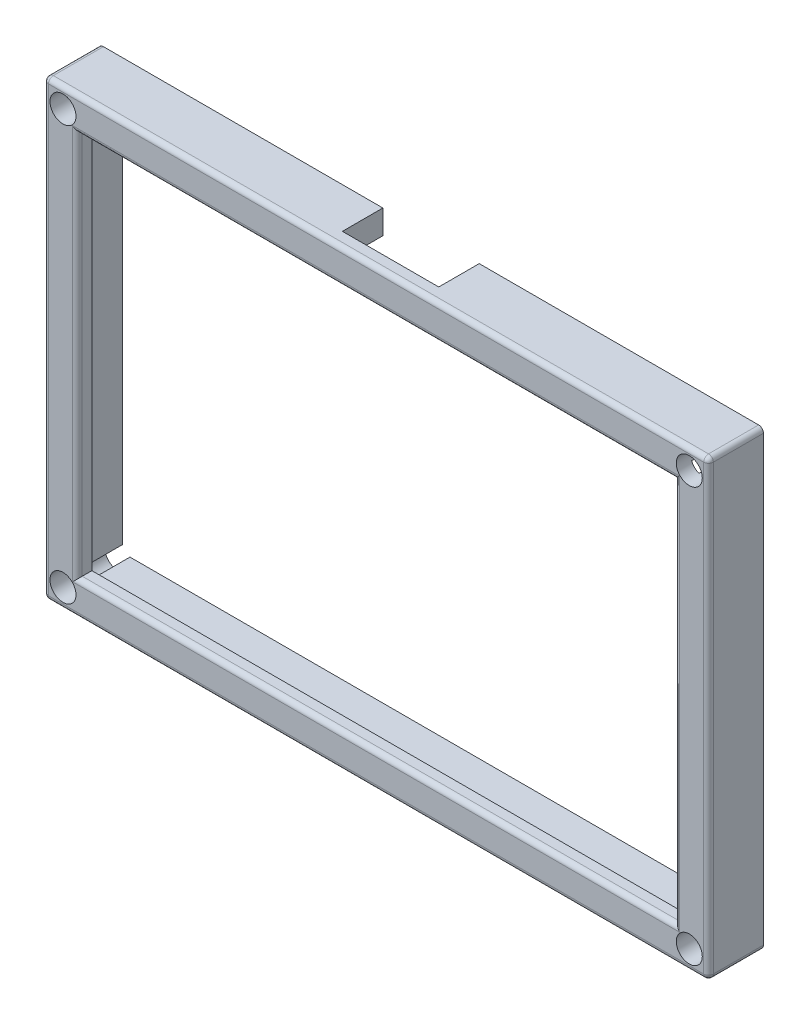
ISO-10303-21;
HEADER;
FILE_DESCRIPTION(('STEP AP214'),'2;1');
FILE_NAME('part.step','',(''),(''),'','','');
FILE_SCHEMA(('AUTOMOTIVE_DESIGN { 1 0 10303 214 1 1 1 1 }'));
ENDSEC;
DATA;
#1=APPLICATION_CONTEXT('core data for automotive mechanical design processes');
#2=APPLICATION_PROTOCOL_DEFINITION('international standard','automotive_design',2000,#1);
#3=PRODUCT_CONTEXT('',#1,'mechanical');
#4=PRODUCT('Part','Part','',(#3));
#5=PRODUCT_RELATED_PRODUCT_CATEGORY('part','',(#4));
#6=PRODUCT_DEFINITION_FORMATION('','',#4);
#7=PRODUCT_DEFINITION_CONTEXT('part definition',#1,'design');
#8=PRODUCT_DEFINITION('design','',#6,#7);
#9=PRODUCT_DEFINITION_SHAPE('','',#8);
#10=(LENGTH_UNIT() NAMED_UNIT(*) SI_UNIT(.MILLI.,.METRE.));
#11=(NAMED_UNIT(*) PLANE_ANGLE_UNIT() SI_UNIT($,.RADIAN.));
#12=(NAMED_UNIT(*) SI_UNIT($,.STERADIAN.) SOLID_ANGLE_UNIT());
#13=UNCERTAINTY_MEASURE_WITH_UNIT(LENGTH_MEASURE(1.E-05),#10,'distance_accuracy_value','');
#14=(GEOMETRIC_REPRESENTATION_CONTEXT(3) GLOBAL_UNCERTAINTY_ASSIGNED_CONTEXT((#13)) GLOBAL_UNIT_ASSIGNED_CONTEXT((#10,
#11,#12)) REPRESENTATION_CONTEXT('',''));
#15=CARTESIAN_POINT('',(0.,0.,0.));
#16=DIRECTION('',(0.,0.,1.));
#17=DIRECTION('',(1.,0.,0.));
#18=AXIS2_PLACEMENT_3D('',#15,#16,#17);
#19=CARTESIAN_POINT('',(-32.5,28.5,4.2));
#20=DIRECTION('',(0.,0.,-1.));
#21=DIRECTION('',(-1.,0.,0.));
#22=AXIS2_PLACEMENT_3D('',#19,#20,#21);
#23=CYLINDRICAL_SURFACE('',#22,1.35);
#24=CARTESIAN_POINT('',(-32.5,28.5,0.));
#25=DIRECTION('',(0.,0.,1.));
#26=DIRECTION('',(1.,0.,0.));
#27=AXIS2_PLACEMENT_3D('',#24,#25,#26);
#28=CIRCLE('',#27,1.35);
#29=CARTESIAN_POINT('',(-32.,29.7539936203984,0.));
#30=VERTEX_POINT('',#29);
#31=CARTESIAN_POINT('',(-31.2460063796015,29.,0.));
#32=VERTEX_POINT('',#31);
#33=EDGE_CURVE('E233',#30,#32,#28,.T.);
#34=ORIENTED_EDGE('',*,*,#33,.F.);
#35=DIRECTION('',(0.,0.,-1.));
#36=VECTOR('',#35,1.);
#37=CARTESIAN_POINT('',(-32.,29.7539936203984,4.2));
#38=LINE('',#37,#36);
#39=CARTESIAN_POINT('',(-32.,29.7539936203984,4.2));
#40=VERTEX_POINT('',#39);
#41=EDGE_CURVE('E346',#40,#30,#38,.T.);
#42=ORIENTED_EDGE('',*,*,#41,.F.);
#43=CARTESIAN_POINT('',(-32.5,28.5,4.2));
#44=DIRECTION('',(0.,0.,1.));
#45=DIRECTION('',(1.,0.,0.));
#46=AXIS2_PLACEMENT_3D('',#43,#44,#45);
#47=CIRCLE('',#46,1.35);
#48=CARTESIAN_POINT('',(-31.2460063796015,29.,4.2));
#49=VERTEX_POINT('',#48);
#50=EDGE_CURVE('E437',#40,#49,#47,.F.);
#51=ORIENTED_EDGE('',*,*,#50,.T.);
#52=DIRECTION('',(0.,0.,-1.));
#53=VECTOR('',#52,1.);
#54=CARTESIAN_POINT('',(-31.2460063796015,29.,4.2));
#55=LINE('',#54,#53);
#56=EDGE_CURVE('E282',#49,#32,#55,.T.);
#57=ORIENTED_EDGE('',*,*,#56,.T.);
#58=EDGE_LOOP('',(#34,#42,#51,#57));
#59=FACE_BOUND('',#58,.T.);
#60=CARTESIAN_POINT('',(-32.5,28.5,5.7));
#61=DIRECTION('',(0.,0.,1.));
#62=DIRECTION('',(1.,0.,0.));
#63=AXIS2_PLACEMENT_3D('',#60,#61,#62);
#64=CIRCLE('',#63,1.35);
#65=CARTESIAN_POINT('',(-31.15,28.5,5.7));
#66=VERTEX_POINT('',#65);
#67=EDGE_CURVE('E259',#66,#66,#64,.F.);
#68=ORIENTED_EDGE('',*,*,#67,.F.);
#69=EDGE_LOOP('',(#68));
#70=FACE_BOUND('',#69,.T.);
#71=ADVANCED_FACE('F41',(#59,#70),#23,.F.);
#72=CARTESIAN_POINT('',(-32.,0.,4.2));
#73=DIRECTION('',(1.,0.,0.));
#74=DIRECTION('',(0.,0.,-1.));
#75=AXIS2_PLACEMENT_3D('',#72,#73,#74);
#76=PLANE('',#75);
#77=DIRECTION('',(0.,-1.,0.));
#78=VECTOR('',#77,1.);
#79=CARTESIAN_POINT('',(-32.,0.,0.));
#80=LINE('',#79,#78);
#81=CARTESIAN_POINT('',(-32.,70.2460063796016,0.));
#82=VERTEX_POINT('',#81);
#83=EDGE_CURVE('E285',#82,#30,#80,.T.);
#84=ORIENTED_EDGE('',*,*,#83,.F.);
#85=DIRECTION('',(0.,0.,-1.));
#86=VECTOR('',#85,1.);
#87=CARTESIAN_POINT('',(-32.,70.2460063796016,4.2));
#88=LINE('',#87,#86);
#89=CARTESIAN_POINT('',(-32.,70.2460063796016,4.2));
#90=VERTEX_POINT('',#89);
#91=EDGE_CURVE('E344',#90,#82,#88,.T.);
#92=ORIENTED_EDGE('',*,*,#91,.F.);
#93=DIRECTION('',(0.,-1.,0.));
#94=VECTOR('',#93,1.);
#95=CARTESIAN_POINT('',(-32.,0.,4.2));
#96=LINE('',#95,#94);
#97=EDGE_CURVE('E265',#90,#40,#96,.T.);
#98=ORIENTED_EDGE('',*,*,#97,.T.);
#99=ORIENTED_EDGE('',*,*,#41,.T.);
#100=EDGE_LOOP('',(#84,#92,#98,#99));
#101=FACE_BOUND('',#100,.T.);
#102=ADVANCED_FACE('F475',(#101),#76,.T.);
#103=CARTESIAN_POINT('',(-32.5,71.5,4.2));
#104=DIRECTION('',(0.,0.,-1.));
#105=DIRECTION('',(-1.,0.,0.));
#106=AXIS2_PLACEMENT_3D('',#103,#104,#105);
#107=CYLINDRICAL_SURFACE('',#106,1.35);
#108=CARTESIAN_POINT('',(-32.5,71.5,0.));
#109=DIRECTION('',(0.,0.,1.));
#110=DIRECTION('',(1.,0.,0.));
#111=AXIS2_PLACEMENT_3D('',#108,#109,#110);
#112=CIRCLE('',#111,1.35);
#113=CARTESIAN_POINT('',(-31.2460063796015,71.,0.));
#114=VERTEX_POINT('',#113);
#115=EDGE_CURVE('E288',#114,#82,#112,.T.);
#116=ORIENTED_EDGE('',*,*,#115,.F.);
#117=DIRECTION('',(0.,0.,-1.));
#118=VECTOR('',#117,1.);
#119=CARTESIAN_POINT('',(-31.2460063796015,71.,4.2));
#120=LINE('',#119,#118);
#121=CARTESIAN_POINT('',(-31.2460063796015,71.,4.2));
#122=VERTEX_POINT('',#121);
#123=EDGE_CURVE('E342',#122,#114,#120,.T.);
#124=ORIENTED_EDGE('',*,*,#123,.F.);
#125=CARTESIAN_POINT('',(-32.5,71.5,4.2));
#126=DIRECTION('',(0.,0.,1.));
#127=DIRECTION('',(1.,0.,0.));
#128=AXIS2_PLACEMENT_3D('',#125,#126,#127);
#129=CIRCLE('',#128,1.35);
#130=EDGE_CURVE('E900',#122,#90,#129,.F.);
#131=ORIENTED_EDGE('',*,*,#130,.T.);
#132=ORIENTED_EDGE('',*,*,#91,.T.);
#133=EDGE_LOOP('',(#116,#124,#131,#132));
#134=FACE_BOUND('',#133,.T.);
#135=CARTESIAN_POINT('',(-32.5,71.5,5.7));
#136=DIRECTION('',(0.,0.,1.));
#137=DIRECTION('',(1.,0.,0.));
#138=AXIS2_PLACEMENT_3D('',#135,#136,#137);
#139=CIRCLE('',#138,1.35);
#140=CARTESIAN_POINT('',(-31.15,71.5,5.7));
#141=VERTEX_POINT('',#140);
#142=EDGE_CURVE('E887',#141,#141,#139,.F.);
#143=ORIENTED_EDGE('',*,*,#142,.F.);
#144=EDGE_LOOP('',(#143));
#145=FACE_BOUND('',#144,.T.);
#146=ADVANCED_FACE('F481',(#134,#145),#107,.F.);
#147=CARTESIAN_POINT('',(0.,71.,4.2));
#148=DIRECTION('',(0.,1.,0.));
#149=DIRECTION('',(0.,0.,1.));
#150=AXIS2_PLACEMENT_3D('',#147,#148,#149);
#151=PLANE('',#150);
#152=DIRECTION('',(1.,0.,0.));
#153=VECTOR('',#152,1.);
#154=CARTESIAN_POINT('',(0.,71.,0.));
#155=LINE('',#154,#153);
#156=CARTESIAN_POINT('',(-4.99999999999998,71.,0.));
#157=VERTEX_POINT('',#156);
#158=EDGE_CURVE('E291',#114,#157,#155,.T.);
#159=ORIENTED_EDGE('',*,*,#158,.T.);
#160=DIRECTION('',(0.,0.,-1.));
#161=VECTOR('',#160,1.);
#162=CARTESIAN_POINT('',(-4.99999999999998,71.,4.2));
#163=LINE('',#162,#161);
#164=CARTESIAN_POINT('',(-4.99999999999998,71.,4.2));
#165=VERTEX_POINT('',#164);
#166=EDGE_CURVE('E339',#165,#157,#163,.T.);
#167=ORIENTED_EDGE('',*,*,#166,.F.);
#168=DIRECTION('',(1.,0.,0.));
#169=VECTOR('',#168,1.);
#170=CARTESIAN_POINT('',(0.,71.,4.2));
#171=LINE('',#170,#169);
#172=EDGE_CURVE('E268',#122,#165,#171,.T.);
#173=ORIENTED_EDGE('',*,*,#172,.F.);
#174=ORIENTED_EDGE('',*,*,#123,.T.);
#175=EDGE_LOOP('',(#159,#167,#173,#174));
#176=FACE_BOUND('',#175,.T.);
#177=ADVANCED_FACE('F783',(#176),#151,.F.);
#178=CARTESIAN_POINT('',(-4.99999999999998,0.,4.2));
#179=DIRECTION('',(-1.,0.,0.));
#180=DIRECTION('',(0.,0.,1.));
#181=AXIS2_PLACEMENT_3D('',#178,#179,#180);
#182=PLANE('',#181);
#183=DIRECTION('',(0.,1.,0.));
#184=VECTOR('',#183,1.);
#185=CARTESIAN_POINT('',(-4.99999999999998,0.,0.));
#186=LINE('',#185,#184);
#187=CARTESIAN_POINT('',(-4.99999999999998,73.5,0.));
#188=VERTEX_POINT('',#187);
#189=EDGE_CURVE('E293',#157,#188,#186,.T.);
#190=ORIENTED_EDGE('',*,*,#189,.T.);
#191=DIRECTION('',(0.,0.,-1.));
#192=VECTOR('',#191,1.);
#193=CARTESIAN_POINT('',(-4.99999999999998,73.5,4.2));
#194=LINE('',#193,#192);
#195=CARTESIAN_POINT('',(-4.99999999999998,73.5,4.2));
#196=VERTEX_POINT('',#195);
#197=EDGE_CURVE('E336',#196,#188,#194,.T.);
#198=ORIENTED_EDGE('',*,*,#197,.F.);
#199=DIRECTION('',(0.,1.,0.));
#200=VECTOR('',#199,1.);
#201=CARTESIAN_POINT('',(-4.99999999999998,0.,4.2));
#202=LINE('',#201,#200);
#203=EDGE_CURVE('E271',#165,#196,#202,.T.);
#204=ORIENTED_EDGE('',*,*,#203,.F.);
#205=ORIENTED_EDGE('',*,*,#166,.T.);
#206=EDGE_LOOP('',(#190,#198,#204,#205));
#207=FACE_BOUND('',#206,.T.);
#208=ADVANCED_FACE('F682',(#207),#182,.F.);
#209=CARTESIAN_POINT('',(-34.5,0.,4.2));
#210=DIRECTION('',(1.,0.,0.));
#211=DIRECTION('',(0.,0.,-1.));
#212=AXIS2_PLACEMENT_3D('',#209,#210,#211);
#213=PLANE('',#212);
#214=DIRECTION('',(0.,-1.,0.));
#215=VECTOR('',#214,1.);
#216=CARTESIAN_POINT('',(-34.5,73.5,5.2));
#217=LINE('',#216,#215);
#218=CARTESIAN_POINT('',(-34.5,27.,5.2));
#219=VERTEX_POINT('',#218);
#220=CARTESIAN_POINT('',(-34.5,73.,5.2));
#221=VERTEX_POINT('',#220);
#222=EDGE_CURVE('E381',#219,#221,#217,.F.);
#223=ORIENTED_EDGE('',*,*,#222,.T.);
#224=DIRECTION('',(0.,0.,-1.));
#225=VECTOR('',#224,1.);
#226=CARTESIAN_POINT('',(-34.5,73.,0.));
#227=LINE('',#226,#225);
#228=CARTESIAN_POINT('',(-34.5,73.,0.));
#229=VERTEX_POINT('',#228);
#230=EDGE_CURVE('E383',#221,#229,#227,.T.);
#231=ORIENTED_EDGE('',*,*,#230,.T.);
#232=DIRECTION('',(0.,-1.,0.));
#233=VECTOR('',#232,1.);
#234=CARTESIAN_POINT('',(-34.5,0.,0.));
#235=LINE('',#234,#233);
#236=CARTESIAN_POINT('',(-34.5,27.,0.));
#237=VERTEX_POINT('',#236);
#238=EDGE_CURVE('E299',#229,#237,#235,.T.);
#239=ORIENTED_EDGE('',*,*,#238,.T.);
#240=DIRECTION('',(0.,0.,-1.));
#241=VECTOR('',#240,1.);
#242=CARTESIAN_POINT('',(-34.5,27.,4.2));
#243=LINE('',#242,#241);
#244=EDGE_CURVE('E379',#237,#219,#243,.F.);
#245=ORIENTED_EDGE('',*,*,#244,.T.);
#246=EDGE_LOOP('',(#223,#231,#239,#245));
#247=FACE_BOUND('',#246,.T.);
#248=ADVANCED_FACE('F677',(#247),#213,.F.);
#249=CARTESIAN_POINT('',(0.,26.5,4.2));
#250=DIRECTION('',(0.,1.,0.));
#251=DIRECTION('',(0.,0.,1.));
#252=AXIS2_PLACEMENT_3D('',#249,#250,#251);
#253=PLANE('',#252);
#254=DIRECTION('',(1.,0.,0.));
#255=VECTOR('',#254,1.);
#256=CARTESIAN_POINT('',(-34.5,26.5,5.2));
#257=LINE('',#256,#255);
#258=CARTESIAN_POINT('',(34.,26.5,5.2));
#259=VERTEX_POINT('',#258);
#260=CARTESIAN_POINT('',(-34.,26.5,5.2));
#261=VERTEX_POINT('',#260);
#262=EDGE_CURVE('E387',#259,#261,#257,.F.);
#263=ORIENTED_EDGE('',*,*,#262,.T.);
#264=DIRECTION('',(0.,0.,-1.));
#265=VECTOR('',#264,1.);
#266=CARTESIAN_POINT('',(-34.,26.5,4.2));
#267=LINE('',#266,#265);
#268=CARTESIAN_POINT('',(-34.,26.5,0.));
#269=VERTEX_POINT('',#268);
#270=EDGE_CURVE('E389',#261,#269,#267,.T.);
#271=ORIENTED_EDGE('',*,*,#270,.T.);
#272=DIRECTION('',(1.,0.,0.));
#273=VECTOR('',#272,1.);
#274=CARTESIAN_POINT('',(0.,26.5,0.));
#275=LINE('',#274,#273);
#276=CARTESIAN_POINT('',(34.,26.5,0.));
#277=VERTEX_POINT('',#276);
#278=EDGE_CURVE('E303',#269,#277,#275,.T.);
#279=ORIENTED_EDGE('',*,*,#278,.T.);
#280=DIRECTION('',(0.,0.,-1.));
#281=VECTOR('',#280,1.);
#282=CARTESIAN_POINT('',(34.,26.5,5.7));
#283=LINE('',#282,#281);
#284=EDGE_CURVE('E385',#277,#259,#283,.F.);
#285=ORIENTED_EDGE('',*,*,#284,.T.);
#286=EDGE_LOOP('',(#263,#271,#279,#285));
#287=FACE_BOUND('',#286,.T.);
#288=ADVANCED_FACE('F681',(#287),#253,.F.);
#289=CARTESIAN_POINT('',(34.5,0.,4.2));
#290=DIRECTION('',(1.,0.,0.));
#291=DIRECTION('',(0.,0.,-1.));
#292=AXIS2_PLACEMENT_3D('',#289,#290,#291);
#293=PLANE('',#292);
#294=DIRECTION('',(0.,-1.,0.));
#295=VECTOR('',#294,1.);
#296=CARTESIAN_POINT('',(34.5,0.,0.));
#297=LINE('',#296,#295);
#298=CARTESIAN_POINT('',(34.5,73.,0.));
#299=VERTEX_POINT('',#298);
#300=CARTESIAN_POINT('',(34.5,27.,0.));
#301=VERTEX_POINT('',#300);
#302=EDGE_CURVE('E306',#299,#301,#297,.T.);
#303=ORIENTED_EDGE('',*,*,#302,.F.);
#304=DIRECTION('',(0.,0.,-1.));
#305=VECTOR('',#304,1.);
#306=CARTESIAN_POINT('',(34.5,73.,4.2));
#307=LINE('',#306,#305);
#308=CARTESIAN_POINT('',(34.5,73.,5.2));
#309=VERTEX_POINT('',#308);
#310=EDGE_CURVE('E371',#299,#309,#307,.F.);
#311=ORIENTED_EDGE('',*,*,#310,.T.);
#312=DIRECTION('',(0.,1.,0.));
#313=VECTOR('',#312,1.);
#314=CARTESIAN_POINT('',(34.5,0.,5.2));
#315=LINE('',#314,#313);
#316=CARTESIAN_POINT('',(34.5,27.,5.2));
#317=VERTEX_POINT('',#316);
#318=EDGE_CURVE('E368',#309,#317,#315,.F.);
#319=ORIENTED_EDGE('',*,*,#318,.T.);
#320=DIRECTION('',(0.,0.,-1.));
#321=VECTOR('',#320,1.);
#322=CARTESIAN_POINT('',(34.5,27.,0.));
#323=LINE('',#322,#321);
#324=EDGE_CURVE('E366',#317,#301,#323,.T.);
#325=ORIENTED_EDGE('',*,*,#324,.T.);
#326=EDGE_LOOP('',(#303,#311,#319,#325));
#327=FACE_BOUND('',#326,.T.);
#328=ADVANCED_FACE('F692',(#327),#293,.T.);
#329=CARTESIAN_POINT('',(0.,73.5,4.2));
#330=DIRECTION('',(0.,1.,0.));
#331=DIRECTION('',(0.,0.,1.));
#332=AXIS2_PLACEMENT_3D('',#329,#330,#331);
#333=PLANE('',#332);
#334=DIRECTION('',(-1.,0.,0.));
#335=VECTOR('',#334,1.);
#336=CARTESIAN_POINT('',(0.,73.5,5.2));
#337=LINE('',#336,#335);
#338=CARTESIAN_POINT('',(-34.,73.5,5.2));
#339=VERTEX_POINT('',#338);
#340=CARTESIAN_POINT('',(34.,73.5,5.2));
#341=VERTEX_POINT('',#340);
#342=EDGE_CURVE('E375',#339,#341,#337,.F.);
#343=ORIENTED_EDGE('',*,*,#342,.T.);
#344=DIRECTION('',(0.,0.,-1.));
#345=VECTOR('',#344,1.);
#346=CARTESIAN_POINT('',(34.,73.5,4.2));
#347=LINE('',#346,#345);
#348=CARTESIAN_POINT('',(34.,73.5,0.));
#349=VERTEX_POINT('',#348);
#350=EDGE_CURVE('E377',#341,#349,#347,.T.);
#351=ORIENTED_EDGE('',*,*,#350,.T.);
#352=DIRECTION('',(1.,0.,0.));
#353=VECTOR('',#352,1.);
#354=CARTESIAN_POINT('',(0.,73.5,0.));
#355=LINE('',#354,#353);
#356=CARTESIAN_POINT('',(5.00000000000002,73.5,0.));
#357=VERTEX_POINT('',#356);
#358=EDGE_CURVE('E300',#357,#349,#355,.T.);
#359=ORIENTED_EDGE('',*,*,#358,.F.);
#360=DIRECTION('',(0.,0.,-1.));
#361=VECTOR('',#360,1.);
#362=CARTESIAN_POINT('',(5.00000000000002,73.5,4.2));
#363=LINE('',#362,#361);
#364=CARTESIAN_POINT('',(5.00000000000002,73.5,4.2));
#365=VERTEX_POINT('',#364);
#366=EDGE_CURVE('E334',#365,#357,#363,.T.);
#367=ORIENTED_EDGE('',*,*,#366,.F.);
#368=DIRECTION('',(-1.,0.,0.));
#369=VECTOR('',#368,1.);
#370=CARTESIAN_POINT('',(0.,73.5,4.2));
#371=LINE('',#370,#369);
#372=EDGE_CURVE('E903',#365,#196,#371,.T.);
#373=ORIENTED_EDGE('',*,*,#372,.T.);
#374=ORIENTED_EDGE('',*,*,#197,.T.);
#375=CARTESIAN_POINT('',(-34.,73.5,0.));
#376=VERTEX_POINT('',#375);
#377=EDGE_CURVE('E297',#376,#188,#355,.T.);
#378=ORIENTED_EDGE('',*,*,#377,.F.);
#379=DIRECTION('',(0.,0.,-1.));
#380=VECTOR('',#379,1.);
#381=CARTESIAN_POINT('',(-34.,73.5,5.7));
#382=LINE('',#381,#380);
#383=EDGE_CURVE('E373',#376,#339,#382,.F.);
#384=ORIENTED_EDGE('',*,*,#383,.T.);
#385=EDGE_LOOP('',(#343,#351,#359,#367,#373,#374,#378,#384));
#386=FACE_BOUND('',#385,.T.);
#387=ADVANCED_FACE('F701',(#386),#333,.T.);
#388=CARTESIAN_POINT('',(4.99999999999999,0.,4.2));
#389=DIRECTION('',(-1.,0.,0.));
#390=DIRECTION('',(0.,-1.,0.));
#391=AXIS2_PLACEMENT_3D('',#388,#389,#390);
#392=PLANE('',#391);
#393=DIRECTION('',(0.,1.,0.));
#394=VECTOR('',#393,1.);
#395=CARTESIAN_POINT('',(4.99999999999999,0.,0.));
#396=LINE('',#395,#394);
#397=CARTESIAN_POINT('',(5.00000000000002,71.,0.));
#398=VERTEX_POINT('',#397);
#399=EDGE_CURVE('E309',#398,#357,#396,.T.);
#400=ORIENTED_EDGE('',*,*,#399,.F.);
#401=DIRECTION('',(0.,0.,-1.));
#402=VECTOR('',#401,1.);
#403=CARTESIAN_POINT('',(5.00000000000002,71.,4.2));
#404=LINE('',#403,#402);
#405=CARTESIAN_POINT('',(5.00000000000002,71.,4.2));
#406=VERTEX_POINT('',#405);
#407=EDGE_CURVE('E332',#406,#398,#404,.T.);
#408=ORIENTED_EDGE('',*,*,#407,.F.);
#409=DIRECTION('',(0.,1.,0.));
#410=VECTOR('',#409,1.);
#411=CARTESIAN_POINT('',(4.99999999999999,0.,4.2));
#412=LINE('',#411,#410);
#413=EDGE_CURVE('E274',#406,#365,#412,.T.);
#414=ORIENTED_EDGE('',*,*,#413,.T.);
#415=ORIENTED_EDGE('',*,*,#366,.T.);
#416=EDGE_LOOP('',(#400,#408,#414,#415));
#417=FACE_BOUND('',#416,.T.);
#418=ADVANCED_FACE('F710',(#417),#392,.T.);
#419=CARTESIAN_POINT('',(31.2460063796016,71.,0.));
#420=VERTEX_POINT('',#419);
#421=EDGE_CURVE('E294',#398,#420,#155,.T.);
#422=ORIENTED_EDGE('',*,*,#421,.T.);
#423=DIRECTION('',(0.,0.,-1.));
#424=VECTOR('',#423,1.);
#425=CARTESIAN_POINT('',(31.2460063796016,71.,4.2));
#426=LINE('',#425,#424);
#427=CARTESIAN_POINT('',(31.2460063796016,71.,4.2));
#428=VERTEX_POINT('',#427);
#429=EDGE_CURVE('E330',#428,#420,#426,.T.);
#430=ORIENTED_EDGE('',*,*,#429,.F.);
#431=EDGE_CURVE('E272',#406,#428,#171,.T.);
#432=ORIENTED_EDGE('',*,*,#431,.F.);
#433=ORIENTED_EDGE('',*,*,#407,.T.);
#434=EDGE_LOOP('',(#422,#430,#432,#433));
#435=FACE_BOUND('',#434,.T.);
#436=ADVANCED_FACE('F772',(#435),#151,.F.);
#437=CARTESIAN_POINT('',(32.5,71.5,4.2));
#438=DIRECTION('',(0.,0.,-1.));
#439=DIRECTION('',(-1.,0.,0.));
#440=AXIS2_PLACEMENT_3D('',#437,#438,#439);
#441=CYLINDRICAL_SURFACE('',#440,1.35);
#442=CARTESIAN_POINT('',(32.5,71.5,0.));
#443=DIRECTION('',(0.,0.,1.));
#444=DIRECTION('',(1.,0.,0.));
#445=AXIS2_PLACEMENT_3D('',#442,#443,#444);
#446=CIRCLE('',#445,1.35);
#447=CARTESIAN_POINT('',(32.,70.2460063796016,0.));
#448=VERTEX_POINT('',#447);
#449=EDGE_CURVE('E312',#448,#420,#446,.T.);
#450=ORIENTED_EDGE('',*,*,#449,.F.);
#451=DIRECTION('',(0.,0.,-1.));
#452=VECTOR('',#451,1.);
#453=CARTESIAN_POINT('',(32.,70.2460063796016,4.2));
#454=LINE('',#453,#452);
#455=CARTESIAN_POINT('',(32.,70.2460063796016,4.2));
#456=VERTEX_POINT('',#455);
#457=EDGE_CURVE('E328',#456,#448,#454,.T.);
#458=ORIENTED_EDGE('',*,*,#457,.F.);
#459=CARTESIAN_POINT('',(32.5,71.5,4.2));
#460=DIRECTION('',(0.,0.,1.));
#461=DIRECTION('',(1.,0.,0.));
#462=AXIS2_PLACEMENT_3D('',#459,#460,#461);
#463=CIRCLE('',#462,1.35);
#464=EDGE_CURVE('E252',#456,#428,#463,.F.);
#465=ORIENTED_EDGE('',*,*,#464,.T.);
#466=ORIENTED_EDGE('',*,*,#429,.T.);
#467=EDGE_LOOP('',(#450,#458,#465,#466));
#468=FACE_BOUND('',#467,.T.);
#469=CARTESIAN_POINT('',(32.5,71.5,5.7));
#470=DIRECTION('',(0.,0.,1.));
#471=DIRECTION('',(1.,0.,0.));
#472=AXIS2_PLACEMENT_3D('',#469,#470,#471);
#473=CIRCLE('',#472,1.35);
#474=CARTESIAN_POINT('',(33.85,71.5,5.7));
#475=VERTEX_POINT('',#474);
#476=EDGE_CURVE('E889',#475,#475,#473,.F.);
#477=ORIENTED_EDGE('',*,*,#476,.F.);
#478=EDGE_LOOP('',(#477));
#479=FACE_BOUND('',#478,.T.);
#480=ADVANCED_FACE('F763',(#468,#479),#441,.F.);
#481=CARTESIAN_POINT('',(32.,0.,4.2));
#482=DIRECTION('',(1.,0.,0.));
#483=DIRECTION('',(0.,0.,-1.));
#484=AXIS2_PLACEMENT_3D('',#481,#482,#483);
#485=PLANE('',#484);
#486=DIRECTION('',(0.,-1.,0.));
#487=VECTOR('',#486,1.);
#488=CARTESIAN_POINT('',(32.,0.,0.));
#489=LINE('',#488,#487);
#490=CARTESIAN_POINT('',(32.,29.7539936203984,0.));
#491=VERTEX_POINT('',#490);
#492=EDGE_CURVE('E315',#448,#491,#489,.T.);
#493=ORIENTED_EDGE('',*,*,#492,.T.);
#494=DIRECTION('',(0.,0.,-1.));
#495=VECTOR('',#494,1.);
#496=CARTESIAN_POINT('',(32.,29.7539936203984,4.2));
#497=LINE('',#496,#495);
#498=CARTESIAN_POINT('',(32.,29.7539936203984,4.2));
#499=VERTEX_POINT('',#498);
#500=EDGE_CURVE('E326',#499,#491,#497,.T.);
#501=ORIENTED_EDGE('',*,*,#500,.F.);
#502=DIRECTION('',(0.,-1.,0.));
#503=VECTOR('',#502,1.);
#504=CARTESIAN_POINT('',(32.,0.,4.2));
#505=LINE('',#504,#503);
#506=EDGE_CURVE('E277',#456,#499,#505,.T.);
#507=ORIENTED_EDGE('',*,*,#506,.F.);
#508=ORIENTED_EDGE('',*,*,#457,.T.);
#509=EDGE_LOOP('',(#493,#501,#507,#508));
#510=FACE_BOUND('',#509,.T.);
#511=ADVANCED_FACE('F753',(#510),#485,.F.);
#512=CARTESIAN_POINT('',(32.5,28.5,4.2));
#513=DIRECTION('',(0.,0.,-1.));
#514=DIRECTION('',(-1.,0.,0.));
#515=AXIS2_PLACEMENT_3D('',#512,#513,#514);
#516=CYLINDRICAL_SURFACE('',#515,1.35);
#517=CARTESIAN_POINT('',(32.5,28.5,0.));
#518=DIRECTION('',(0.,0.,1.));
#519=DIRECTION('',(1.,0.,0.));
#520=AXIS2_PLACEMENT_3D('',#517,#518,#519);
#521=CIRCLE('',#520,1.35);
#522=CARTESIAN_POINT('',(31.2460063796016,29.,0.));
#523=VERTEX_POINT('',#522);
#524=EDGE_CURVE('E318',#523,#491,#521,.T.);
#525=ORIENTED_EDGE('',*,*,#524,.F.);
#526=DIRECTION('',(0.,0.,-1.));
#527=VECTOR('',#526,1.);
#528=CARTESIAN_POINT('',(31.2460063796016,29.,4.2));
#529=LINE('',#528,#527);
#530=CARTESIAN_POINT('',(31.2460063796016,29.,4.2));
#531=VERTEX_POINT('',#530);
#532=EDGE_CURVE('E324',#531,#523,#529,.T.);
#533=ORIENTED_EDGE('',*,*,#532,.F.);
#534=CARTESIAN_POINT('',(32.5,28.5,4.2));
#535=DIRECTION('',(0.,0.,1.));
#536=DIRECTION('',(1.,0.,0.));
#537=AXIS2_PLACEMENT_3D('',#534,#535,#536);
#538=CIRCLE('',#537,1.35);
#539=EDGE_CURVE('E249',#531,#499,#538,.F.);
#540=ORIENTED_EDGE('',*,*,#539,.T.);
#541=ORIENTED_EDGE('',*,*,#500,.T.);
#542=EDGE_LOOP('',(#525,#533,#540,#541));
#543=FACE_BOUND('',#542,.T.);
#544=CARTESIAN_POINT('',(32.5,28.5,5.7));
#545=DIRECTION('',(0.,0.,1.));
#546=DIRECTION('',(1.,0.,0.));
#547=AXIS2_PLACEMENT_3D('',#544,#545,#546);
#548=CIRCLE('',#547,1.35);
#549=CARTESIAN_POINT('',(33.85,28.5,5.7));
#550=VERTEX_POINT('',#549);
#551=EDGE_CURVE('E262',#550,#550,#548,.F.);
#552=ORIENTED_EDGE('',*,*,#551,.F.);
#553=EDGE_LOOP('',(#552));
#554=FACE_BOUND('',#553,.T.);
#555=ADVANCED_FACE('F745',(#543,#554),#516,.F.);
#556=CARTESIAN_POINT('',(0.,29.,4.2));
#557=DIRECTION('',(0.,1.,0.));
#558=DIRECTION('',(0.,0.,1.));
#559=AXIS2_PLACEMENT_3D('',#556,#557,#558);
#560=PLANE('',#559);
#561=DIRECTION('',(1.,0.,0.));
#562=VECTOR('',#561,1.);
#563=CARTESIAN_POINT('',(0.,29.,0.));
#564=LINE('',#563,#562);
#565=EDGE_CURVE('E269',#32,#523,#564,.T.);
#566=ORIENTED_EDGE('',*,*,#565,.F.);
#567=ORIENTED_EDGE('',*,*,#56,.F.);
#568=DIRECTION('',(1.,0.,0.));
#569=VECTOR('',#568,1.);
#570=CARTESIAN_POINT('',(0.,29.,4.2));
#571=LINE('',#570,#569);
#572=EDGE_CURVE('E279',#49,#531,#571,.T.);
#573=ORIENTED_EDGE('',*,*,#572,.T.);
#574=ORIENTED_EDGE('',*,*,#532,.T.);
#575=EDGE_LOOP('',(#566,#567,#573,#574));
#576=FACE_BOUND('',#575,.T.);
#577=ADVANCED_FACE('F673',(#576),#560,.T.);
#578=CARTESIAN_POINT('',(0.,0.,0.));
#579=DIRECTION('',(0.,0.,1.));
#580=DIRECTION('',(1.,0.,0.));
#581=AXIS2_PLACEMENT_3D('',#578,#579,#580);
#582=PLANE('',#581);
#583=ORIENTED_EDGE('',*,*,#358,.T.);
#584=CARTESIAN_POINT('',(34.,73.,0.));
#585=DIRECTION('',(0.,0.,1.));
#586=DIRECTION('',(1.,0.,0.));
#587=AXIS2_PLACEMENT_3D('',#584,#585,#586);
#588=CIRCLE('',#587,0.5);
#589=EDGE_CURVE('E11',#349,#299,#588,.F.);
#590=ORIENTED_EDGE('',*,*,#589,.T.);
#591=ORIENTED_EDGE('',*,*,#302,.T.);
#592=CARTESIAN_POINT('',(34.,27.,0.));
#593=DIRECTION('',(0.,0.,1.));
#594=DIRECTION('',(1.,0.,0.));
#595=AXIS2_PLACEMENT_3D('',#592,#593,#594);
#596=CIRCLE('',#595,0.5);
#597=EDGE_CURVE('E398',#301,#277,#596,.F.);
#598=ORIENTED_EDGE('',*,*,#597,.T.);
#599=ORIENTED_EDGE('',*,*,#278,.F.);
#600=CARTESIAN_POINT('',(-34.,27.,0.));
#601=DIRECTION('',(0.,0.,1.));
#602=DIRECTION('',(1.,0.,0.));
#603=AXIS2_PLACEMENT_3D('',#600,#601,#602);
#604=CIRCLE('',#603,0.5);
#605=EDGE_CURVE('E400',#269,#237,#604,.F.);
#606=ORIENTED_EDGE('',*,*,#605,.T.);
#607=ORIENTED_EDGE('',*,*,#238,.F.);
#608=CARTESIAN_POINT('',(-34.,73.,0.));
#609=DIRECTION('',(0.,0.,1.));
#610=DIRECTION('',(1.,0.,0.));
#611=AXIS2_PLACEMENT_3D('',#608,#609,#610);
#612=CIRCLE('',#611,0.5);
#613=EDGE_CURVE('E50',#229,#376,#612,.F.);
#614=ORIENTED_EDGE('',*,*,#613,.T.);
#615=ORIENTED_EDGE('',*,*,#377,.T.);
#616=ORIENTED_EDGE('',*,*,#189,.F.);
#617=ORIENTED_EDGE('',*,*,#158,.F.);
#618=ORIENTED_EDGE('',*,*,#115,.T.);
#619=ORIENTED_EDGE('',*,*,#83,.T.);
#620=ORIENTED_EDGE('',*,*,#33,.T.);
#621=ORIENTED_EDGE('',*,*,#565,.T.);
#622=ORIENTED_EDGE('',*,*,#524,.T.);
#623=ORIENTED_EDGE('',*,*,#492,.F.);
#624=ORIENTED_EDGE('',*,*,#449,.T.);
#625=ORIENTED_EDGE('',*,*,#421,.F.);
#626=ORIENTED_EDGE('',*,*,#399,.T.);
#627=EDGE_LOOP('',(#583,#590,#591,#598,#599,#606,#607,#614,#615,#616,#617,#618,#619,#620,#621,
#622,#623,#624,#625,#626));
#628=FACE_BOUND('',#627,.T.);
#629=ADVANCED_FACE('F717',(#628),#582,.F.);
#630=CARTESIAN_POINT('',(-31.,0.,5.7));
#631=DIRECTION('',(1.,0.,0.));
#632=DIRECTION('',(0.,0.,-1.));
#633=AXIS2_PLACEMENT_3D('',#630,#631,#632);
#634=PLANE('',#633);
#635=DIRECTION('',(0.,0.,-1.));
#636=VECTOR('',#635,1.);
#637=CARTESIAN_POINT('',(-31.,70.,5.7));
#638=LINE('',#637,#636);
#639=CARTESIAN_POINT('',(-31.,70.,5.2));
#640=VERTEX_POINT('',#639);
#641=CARTESIAN_POINT('',(-31.,70.,4.2));
#642=VERTEX_POINT('',#641);
#643=EDGE_CURVE('E226',#640,#642,#638,.T.);
#644=ORIENTED_EDGE('',*,*,#643,.F.);
#645=DIRECTION('',(0.,-1.,0.));
#646=VECTOR('',#645,1.);
#647=CARTESIAN_POINT('',(-31.,0.,5.2));
#648=LINE('',#647,#646);
#649=CARTESIAN_POINT('',(-31.,30.,5.2));
#650=VERTEX_POINT('',#649);
#651=EDGE_CURVE('E396',#640,#650,#648,.T.);
#652=ORIENTED_EDGE('',*,*,#651,.T.);
#653=DIRECTION('',(0.,0.,-1.));
#654=VECTOR('',#653,1.);
#655=CARTESIAN_POINT('',(-31.,30.,5.7));
#656=LINE('',#655,#654);
#657=CARTESIAN_POINT('',(-31.,30.,4.2));
#658=VERTEX_POINT('',#657);
#659=EDGE_CURVE('E248',#650,#658,#656,.T.);
#660=ORIENTED_EDGE('',*,*,#659,.T.);
#661=DIRECTION('',(0.,-1.,0.));
#662=VECTOR('',#661,1.);
#663=CARTESIAN_POINT('',(-31.,0.,4.2));
#664=LINE('',#663,#662);
#665=EDGE_CURVE('E241',#642,#658,#664,.T.);
#666=ORIENTED_EDGE('',*,*,#665,.F.);
#667=EDGE_LOOP('',(#644,#652,#660,#666));
#668=FACE_BOUND('',#667,.T.);
#669=ADVANCED_FACE('F246',(#668),#634,.T.);
#670=CARTESIAN_POINT('',(0.,70.,5.7));
#671=DIRECTION('',(0.,1.,0.));
#672=DIRECTION('',(0.,0.,1.));
#673=AXIS2_PLACEMENT_3D('',#670,#671,#672);
#674=PLANE('',#673);
#675=DIRECTION('',(0.,0.,-1.));
#676=VECTOR('',#675,1.);
#677=CARTESIAN_POINT('',(31.,70.,5.7));
#678=LINE('',#677,#676);
#679=CARTESIAN_POINT('',(31.,70.,5.2));
#680=VERTEX_POINT('',#679);
#681=CARTESIAN_POINT('',(31.,70.,4.2));
#682=VERTEX_POINT('',#681);
#683=EDGE_CURVE('E234',#680,#682,#678,.T.);
#684=ORIENTED_EDGE('',*,*,#683,.F.);
#685=DIRECTION('',(1.,0.,0.));
#686=VECTOR('',#685,1.);
#687=CARTESIAN_POINT('',(-31.,70.,5.2));
#688=LINE('',#687,#686);
#689=EDGE_CURVE('E58',#680,#640,#688,.F.);
#690=ORIENTED_EDGE('',*,*,#689,.T.);
#691=ORIENTED_EDGE('',*,*,#643,.T.);
#692=DIRECTION('',(1.,0.,0.));
#693=VECTOR('',#692,1.);
#694=CARTESIAN_POINT('',(0.,70.,4.2));
#695=LINE('',#694,#693);
#696=EDGE_CURVE('E229',#642,#682,#695,.T.);
#697=ORIENTED_EDGE('',*,*,#696,.T.);
#698=EDGE_LOOP('',(#684,#690,#691,#697));
#699=FACE_BOUND('',#698,.T.);
#700=ADVANCED_FACE('F228',(#699),#674,.F.);
#701=CARTESIAN_POINT('',(31.,0.,5.7));
#702=DIRECTION('',(1.,0.,0.));
#703=DIRECTION('',(0.,1.,0.));
#704=AXIS2_PLACEMENT_3D('',#701,#702,#703);
#705=PLANE('',#704);
#706=DIRECTION('',(0.,0.,-1.));
#707=VECTOR('',#706,1.);
#708=CARTESIAN_POINT('',(31.,30.,5.7));
#709=LINE('',#708,#707);
#710=CARTESIAN_POINT('',(31.,30.,5.2));
#711=VERTEX_POINT('',#710);
#712=CARTESIAN_POINT('',(31.,30.,4.2));
#713=VERTEX_POINT('',#712);
#714=EDGE_CURVE('E261',#711,#713,#709,.T.);
#715=ORIENTED_EDGE('',*,*,#714,.F.);
#716=DIRECTION('',(0.,-1.,0.));
#717=VECTOR('',#716,1.);
#718=CARTESIAN_POINT('',(31.,70.,5.2));
#719=LINE('',#718,#717);
#720=EDGE_CURVE('E66',#711,#680,#719,.F.);
#721=ORIENTED_EDGE('',*,*,#720,.T.);
#722=ORIENTED_EDGE('',*,*,#683,.T.);
#723=DIRECTION('',(0.,-1.,0.));
#724=VECTOR('',#723,1.);
#725=CARTESIAN_POINT('',(31.,0.,4.2));
#726=LINE('',#725,#724);
#727=EDGE_CURVE('E244',#682,#713,#726,.T.);
#728=ORIENTED_EDGE('',*,*,#727,.T.);
#729=EDGE_LOOP('',(#715,#721,#722,#728));
#730=FACE_BOUND('',#729,.T.);
#731=ADVANCED_FACE('F465',(#730),#705,.F.);
#732=CARTESIAN_POINT('',(0.,30.,5.7));
#733=DIRECTION('',(0.,1.,0.));
#734=DIRECTION('',(-1.,0.,0.));
#735=AXIS2_PLACEMENT_3D('',#732,#733,#734);
#736=PLANE('',#735);
#737=ORIENTED_EDGE('',*,*,#659,.F.);
#738=DIRECTION('',(1.,0.,0.));
#739=VECTOR('',#738,1.);
#740=CARTESIAN_POINT('',(0.,30.,5.2));
#741=LINE('',#740,#739);
#742=EDGE_CURVE('E391',#650,#711,#741,.T.);
#743=ORIENTED_EDGE('',*,*,#742,.T.);
#744=ORIENTED_EDGE('',*,*,#714,.T.);
#745=DIRECTION('',(1.,0.,0.));
#746=VECTOR('',#745,1.);
#747=CARTESIAN_POINT('',(0.,30.,4.2));
#748=LINE('',#747,#746);
#749=EDGE_CURVE('E257',#658,#713,#748,.T.);
#750=ORIENTED_EDGE('',*,*,#749,.F.);
#751=EDGE_LOOP('',(#737,#743,#744,#750));
#752=FACE_BOUND('',#751,.T.);
#753=ADVANCED_FACE('F464',(#752),#736,.T.);
#754=CARTESIAN_POINT('',(0.,0.,5.7));
#755=DIRECTION('',(0.,0.,1.));
#756=DIRECTION('',(1.,0.,0.));
#757=AXIS2_PLACEMENT_3D('',#754,#755,#756);
#758=PLANE('',#757);
#759=DIRECTION('',(1.,0.,0.));
#760=VECTOR('',#759,1.);
#761=CARTESIAN_POINT('',(34.5,27.,5.7));
#762=LINE('',#761,#760);
#763=CARTESIAN_POINT('',(-34.,27.,5.7));
#764=VERTEX_POINT('',#763);
#765=CARTESIAN_POINT('',(34.,27.,5.7));
#766=VERTEX_POINT('',#765);
#767=EDGE_CURVE('E357',#764,#766,#762,.T.);
#768=ORIENTED_EDGE('',*,*,#767,.T.);
#769=DIRECTION('',(0.,1.,0.));
#770=VECTOR('',#769,1.);
#771=CARTESIAN_POINT('',(34.,0.,5.7));
#772=LINE('',#771,#770);
#773=CARTESIAN_POINT('',(34.,73.,5.7));
#774=VERTEX_POINT('',#773);
#775=EDGE_CURVE('E363',#766,#774,#772,.T.);
#776=ORIENTED_EDGE('',*,*,#775,.T.);
#777=DIRECTION('',(-1.,0.,0.));
#778=VECTOR('',#777,1.);
#779=CARTESIAN_POINT('',(0.,73.,5.7));
#780=LINE('',#779,#778);
#781=CARTESIAN_POINT('',(-34.,73.,5.7));
#782=VERTEX_POINT('',#781);
#783=EDGE_CURVE('E361',#774,#782,#780,.T.);
#784=ORIENTED_EDGE('',*,*,#783,.T.);
#785=DIRECTION('',(0.,-1.,0.));
#786=VECTOR('',#785,1.);
#787=CARTESIAN_POINT('',(-34.,26.5,5.7));
#788=LINE('',#787,#786);
#789=EDGE_CURVE('E359',#782,#764,#788,.T.);
#790=ORIENTED_EDGE('',*,*,#789,.T.);
#791=EDGE_LOOP('',(#768,#776,#784,#790));
#792=FACE_BOUND('',#791,.T.);
#793=DIRECTION('',(0.,-1.,0.));
#794=VECTOR('',#793,1.);
#795=CARTESIAN_POINT('',(31.5,30.,5.7));
#796=LINE('',#795,#794);
#797=CARTESIAN_POINT('',(31.5,70.5,5.7));
#798=VERTEX_POINT('',#797);
#799=CARTESIAN_POINT('',(31.5,29.5,5.7));
#800=VERTEX_POINT('',#799);
#801=EDGE_CURVE('E352',#798,#800,#796,.T.);
#802=ORIENTED_EDGE('',*,*,#801,.T.);
#803=DIRECTION('',(1.,0.,0.));
#804=VECTOR('',#803,1.);
#805=CARTESIAN_POINT('',(0.,29.5,5.7));
#806=LINE('',#805,#804);
#807=CARTESIAN_POINT('',(-31.5,29.5,5.7));
#808=VERTEX_POINT('',#807);
#809=EDGE_CURVE('E354',#800,#808,#806,.F.);
#810=ORIENTED_EDGE('',*,*,#809,.T.);
#811=DIRECTION('',(0.,-1.,0.));
#812=VECTOR('',#811,1.);
#813=CARTESIAN_POINT('',(-31.5,0.,5.7));
#814=LINE('',#813,#812);
#815=CARTESIAN_POINT('',(-31.5,70.5,5.7));
#816=VERTEX_POINT('',#815);
#817=EDGE_CURVE('E348',#808,#816,#814,.F.);
#818=ORIENTED_EDGE('',*,*,#817,.T.);
#819=DIRECTION('',(1.,0.,0.));
#820=VECTOR('',#819,1.);
#821=CARTESIAN_POINT('',(31.,70.5,5.7));
#822=LINE('',#821,#820);
#823=EDGE_CURVE('E350',#816,#798,#822,.T.);
#824=ORIENTED_EDGE('',*,*,#823,.T.);
#825=EDGE_LOOP('',(#802,#810,#818,#824));
#826=FACE_BOUND('',#825,.T.);
#827=ORIENTED_EDGE('',*,*,#67,.T.);
#828=EDGE_LOOP('',(#827));
#829=FACE_BOUND('',#828,.T.);
#830=ORIENTED_EDGE('',*,*,#142,.T.);
#831=EDGE_LOOP('',(#830));
#832=FACE_BOUND('',#831,.T.);
#833=ORIENTED_EDGE('',*,*,#476,.T.);
#834=EDGE_LOOP('',(#833));
#835=FACE_BOUND('',#834,.T.);
#836=ORIENTED_EDGE('',*,*,#551,.T.);
#837=EDGE_LOOP('',(#836));
#838=FACE_BOUND('',#837,.T.);
#839=ADVANCED_FACE('F455',(#792,#826,#829,#832,#835,#838),#758,.T.);
#840=CARTESIAN_POINT('',(0.,0.,4.2));
#841=DIRECTION('',(0.,0.,1.));
#842=DIRECTION('',(1.,0.,0.));
#843=AXIS2_PLACEMENT_3D('',#840,#841,#842);
#844=PLANE('',#843);
#845=ORIENTED_EDGE('',*,*,#97,.F.);
#846=ORIENTED_EDGE('',*,*,#130,.F.);
#847=ORIENTED_EDGE('',*,*,#172,.T.);
#848=ORIENTED_EDGE('',*,*,#203,.T.);
#849=ORIENTED_EDGE('',*,*,#372,.F.);
#850=ORIENTED_EDGE('',*,*,#413,.F.);
#851=ORIENTED_EDGE('',*,*,#431,.T.);
#852=ORIENTED_EDGE('',*,*,#464,.F.);
#853=ORIENTED_EDGE('',*,*,#506,.T.);
#854=ORIENTED_EDGE('',*,*,#539,.F.);
#855=ORIENTED_EDGE('',*,*,#572,.F.);
#856=ORIENTED_EDGE('',*,*,#50,.F.);
#857=EDGE_LOOP('',(#845,#846,#847,#848,#849,#850,#851,#852,#853,#854,#855,#856));
#858=FACE_BOUND('',#857,.T.);
#859=ORIENTED_EDGE('',*,*,#665,.T.);
#860=ORIENTED_EDGE('',*,*,#749,.T.);
#861=ORIENTED_EDGE('',*,*,#727,.F.);
#862=ORIENTED_EDGE('',*,*,#696,.F.);
#863=EDGE_LOOP('',(#859,#860,#861,#862));
#864=FACE_BOUND('',#863,.T.);
#865=ADVANCED_FACE('F239',(#858,#864),#844,.F.);
#866=CARTESIAN_POINT('',(-34.,27.,4.2));
#867=DIRECTION('',(0.,0.,-1.));
#868=DIRECTION('',(-1.,0.,0.));
#869=AXIS2_PLACEMENT_3D('',#866,#867,#868);
#870=CYLINDRICAL_SURFACE('',#869,0.5);
#871=ORIENTED_EDGE('',*,*,#605,.F.);
#872=ORIENTED_EDGE('',*,*,#270,.F.);
#873=CARTESIAN_POINT('',(-34.,27.,5.2));
#874=DIRECTION('',(0.,0.,1.));
#875=DIRECTION('',(1.,0.,0.));
#876=AXIS2_PLACEMENT_3D('',#873,#874,#875);
#877=CIRCLE('',#876,0.5);
#878=EDGE_CURVE('E434',#219,#261,#877,.T.);
#879=ORIENTED_EDGE('',*,*,#878,.F.);
#880=ORIENTED_EDGE('',*,*,#244,.F.);
#881=EDGE_LOOP('',(#871,#872,#879,#880));
#882=FACE_BOUND('',#881,.T.);
#883=ADVANCED_FACE('F531',(#882),#870,.T.);
#884=CARTESIAN_POINT('',(-34.,0.,5.2));
#885=DIRECTION('',(0.,1.,0.));
#886=DIRECTION('',(0.,0.,1.));
#887=AXIS2_PLACEMENT_3D('',#884,#885,#886);
#888=CYLINDRICAL_SURFACE('',#887,0.5);
#889=CARTESIAN_POINT('',(-34.,73.,5.2));
#890=DIRECTION('',(0.,1.,0.));
#891=DIRECTION('',(0.,0.,1.));
#892=AXIS2_PLACEMENT_3D('',#889,#890,#891);
#893=CIRCLE('',#892,0.5);
#894=EDGE_CURVE('E428',#221,#782,#893,.T.);
#895=ORIENTED_EDGE('',*,*,#894,.F.);
#896=ORIENTED_EDGE('',*,*,#222,.F.);
#897=CARTESIAN_POINT('',(-34.,27.,5.2));
#898=DIRECTION('',(0.,-1.,0.));
#899=DIRECTION('',(0.,0.,-1.));
#900=AXIS2_PLACEMENT_3D('',#897,#898,#899);
#901=CIRCLE('',#900,0.5);
#902=EDGE_CURVE('E431',#764,#219,#901,.T.);
#903=ORIENTED_EDGE('',*,*,#902,.F.);
#904=ORIENTED_EDGE('',*,*,#789,.F.);
#905=EDGE_LOOP('',(#895,#896,#903,#904));
#906=FACE_BOUND('',#905,.T.);
#907=ADVANCED_FACE('F527',(#906),#888,.T.);
#908=CARTESIAN_POINT('',(-34.,73.,4.2));
#909=DIRECTION('',(0.,0.,1.));
#910=DIRECTION('',(1.,0.,0.));
#911=AXIS2_PLACEMENT_3D('',#908,#909,#910);
#912=CYLINDRICAL_SURFACE('',#911,0.5);
#913=ORIENTED_EDGE('',*,*,#613,.F.);
#914=ORIENTED_EDGE('',*,*,#230,.F.);
#915=CARTESIAN_POINT('',(-34.,73.,5.2));
#916=DIRECTION('',(0.,0.,1.));
#917=DIRECTION('',(1.,0.,0.));
#918=AXIS2_PLACEMENT_3D('',#915,#916,#917);
#919=CIRCLE('',#918,0.5);
#920=EDGE_CURVE('E425',#339,#221,#919,.T.);
#921=ORIENTED_EDGE('',*,*,#920,.F.);
#922=ORIENTED_EDGE('',*,*,#383,.F.);
#923=EDGE_LOOP('',(#913,#914,#921,#922));
#924=FACE_BOUND('',#923,.T.);
#925=ADVANCED_FACE('F523',(#924),#912,.T.);
#926=CARTESIAN_POINT('',(-34.,27.,5.2));
#927=DIRECTION('',(-1.,0.,0.));
#928=DIRECTION('',(0.,0.,1.));
#929=AXIS2_PLACEMENT_3D('',#926,#927,#928);
#930=SPHERICAL_SURFACE('',#929,0.5);
#931=ORIENTED_EDGE('',*,*,#902,.T.);
#932=ORIENTED_EDGE('',*,*,#878,.T.);
#933=CARTESIAN_POINT('',(-34.,27.,5.2));
#934=DIRECTION('',(-1.,0.,0.));
#935=DIRECTION('',(0.,0.,1.));
#936=AXIS2_PLACEMENT_3D('',#933,#934,#935);
#937=CIRCLE('',#936,0.5);
#938=EDGE_CURVE('E422',#764,#261,#937,.F.);
#939=ORIENTED_EDGE('',*,*,#938,.F.);
#940=EDGE_LOOP('',(#931,#932,#939));
#941=FACE_BOUND('',#940,.T.);
#942=ADVANCED_FACE('F519',(#941),#930,.T.);
#943=CARTESIAN_POINT('',(-34.,73.,5.2));
#944=DIRECTION('',(-1.,0.,0.));
#945=DIRECTION('',(0.,0.,1.));
#946=AXIS2_PLACEMENT_3D('',#943,#944,#945);
#947=SPHERICAL_SURFACE('',#946,0.5);
#948=ORIENTED_EDGE('',*,*,#920,.T.);
#949=ORIENTED_EDGE('',*,*,#894,.T.);
#950=CARTESIAN_POINT('',(-34.,73.,5.2));
#951=DIRECTION('',(-1.,0.,0.));
#952=DIRECTION('',(0.,0.,1.));
#953=AXIS2_PLACEMENT_3D('',#950,#951,#952);
#954=CIRCLE('',#953,0.5);
#955=EDGE_CURVE('E419',#339,#782,#954,.F.);
#956=ORIENTED_EDGE('',*,*,#955,.F.);
#957=EDGE_LOOP('',(#948,#949,#956));
#958=FACE_BOUND('',#957,.T.);
#959=ADVANCED_FACE('F515',(#958),#947,.T.);
#960=CARTESIAN_POINT('',(34.,27.,4.2));
#961=DIRECTION('',(0.,0.,1.));
#962=DIRECTION('',(1.,0.,0.));
#963=AXIS2_PLACEMENT_3D('',#960,#961,#962);
#964=CYLINDRICAL_SURFACE('',#963,0.5);
#965=ORIENTED_EDGE('',*,*,#597,.F.);
#966=ORIENTED_EDGE('',*,*,#324,.F.);
#967=CARTESIAN_POINT('',(34.,27.,5.2));
#968=DIRECTION('',(0.,0.,1.));
#969=DIRECTION('',(1.,0.,0.));
#970=AXIS2_PLACEMENT_3D('',#967,#968,#969);
#971=CIRCLE('',#970,0.5);
#972=EDGE_CURVE('E416',#259,#317,#971,.T.);
#973=ORIENTED_EDGE('',*,*,#972,.F.);
#974=ORIENTED_EDGE('',*,*,#284,.F.);
#975=EDGE_LOOP('',(#965,#966,#973,#974));
#976=FACE_BOUND('',#975,.T.);
#977=ADVANCED_FACE('F511',(#976),#964,.T.);
#978=CARTESIAN_POINT('',(0.,27.,5.2));
#979=DIRECTION('',(-1.,0.,0.));
#980=DIRECTION('',(0.,0.,1.));
#981=AXIS2_PLACEMENT_3D('',#978,#979,#980);
#982=CYLINDRICAL_SURFACE('',#981,0.5);
#983=ORIENTED_EDGE('',*,*,#938,.T.);
#984=ORIENTED_EDGE('',*,*,#262,.F.);
#985=CARTESIAN_POINT('',(34.,27.,5.2));
#986=DIRECTION('',(1.,0.,0.));
#987=DIRECTION('',(0.,0.,-1.));
#988=AXIS2_PLACEMENT_3D('',#985,#986,#987);
#989=CIRCLE('',#988,0.5);
#990=EDGE_CURVE('E413',#766,#259,#989,.T.);
#991=ORIENTED_EDGE('',*,*,#990,.F.);
#992=ORIENTED_EDGE('',*,*,#767,.F.);
#993=EDGE_LOOP('',(#983,#984,#991,#992));
#994=FACE_BOUND('',#993,.T.);
#995=ADVANCED_FACE('F507',(#994),#982,.T.);
#996=CARTESIAN_POINT('',(0.,73.,5.2));
#997=DIRECTION('',(-1.,0.,0.));
#998=DIRECTION('',(0.,0.,1.));
#999=AXIS2_PLACEMENT_3D('',#996,#997,#998);
#1000=CYLINDRICAL_SURFACE('',#999,0.5);
#1001=ORIENTED_EDGE('',*,*,#955,.T.);
#1002=ORIENTED_EDGE('',*,*,#783,.F.);
#1003=CARTESIAN_POINT('',(34.,73.,5.2));
#1004=DIRECTION('',(1.,0.,0.));
#1005=DIRECTION('',(0.,0.,-1.));
#1006=AXIS2_PLACEMENT_3D('',#1003,#1004,#1005);
#1007=CIRCLE('',#1006,0.5);
#1008=EDGE_CURVE('E410',#341,#774,#1007,.T.);
#1009=ORIENTED_EDGE('',*,*,#1008,.F.);
#1010=ORIENTED_EDGE('',*,*,#342,.F.);
#1011=EDGE_LOOP('',(#1001,#1002,#1009,#1010));
#1012=FACE_BOUND('',#1011,.T.);
#1013=ADVANCED_FACE('F503',(#1012),#1000,.T.);
#1014=CARTESIAN_POINT('',(34.,73.,4.2));
#1015=DIRECTION('',(0.,0.,-1.));
#1016=DIRECTION('',(-1.,0.,0.));
#1017=AXIS2_PLACEMENT_3D('',#1014,#1015,#1016);
#1018=CYLINDRICAL_SURFACE('',#1017,0.5);
#1019=ORIENTED_EDGE('',*,*,#589,.F.);
#1020=ORIENTED_EDGE('',*,*,#350,.F.);
#1021=CARTESIAN_POINT('',(34.,73.,5.2));
#1022=DIRECTION('',(0.,0.,1.));
#1023=DIRECTION('',(1.,0.,0.));
#1024=AXIS2_PLACEMENT_3D('',#1021,#1022,#1023);
#1025=CIRCLE('',#1024,0.5);
#1026=EDGE_CURVE('E407',#309,#341,#1025,.T.);
#1027=ORIENTED_EDGE('',*,*,#1026,.F.);
#1028=ORIENTED_EDGE('',*,*,#310,.F.);
#1029=EDGE_LOOP('',(#1019,#1020,#1027,#1028));
#1030=FACE_BOUND('',#1029,.T.);
#1031=ADVANCED_FACE('F499',(#1030),#1018,.T.);
#1032=CARTESIAN_POINT('',(34.,27.,5.2));
#1033=DIRECTION('',(0.,-1.,0.));
#1034=DIRECTION('',(0.,0.,-1.));
#1035=AXIS2_PLACEMENT_3D('',#1032,#1033,#1034);
#1036=SPHERICAL_SURFACE('',#1035,0.5);
#1037=ORIENTED_EDGE('',*,*,#990,.T.);
#1038=ORIENTED_EDGE('',*,*,#972,.T.);
#1039=CARTESIAN_POINT('',(34.,27.,5.2));
#1040=DIRECTION('',(0.,-1.,0.));
#1041=DIRECTION('',(0.,0.,-1.));
#1042=AXIS2_PLACEMENT_3D('',#1039,#1040,#1041);
#1043=CIRCLE('',#1042,0.5);
#1044=EDGE_CURVE('E405',#766,#317,#1043,.F.);
#1045=ORIENTED_EDGE('',*,*,#1044,.F.);
#1046=EDGE_LOOP('',(#1037,#1038,#1045));
#1047=FACE_BOUND('',#1046,.T.);
#1048=ADVANCED_FACE('F495',(#1047),#1036,.T.);
#1049=CARTESIAN_POINT('',(34.,73.,5.2));
#1050=DIRECTION('',(0.,1.,0.));
#1051=DIRECTION('',(0.,0.,1.));
#1052=AXIS2_PLACEMENT_3D('',#1049,#1050,#1051);
#1053=SPHERICAL_SURFACE('',#1052,0.5);
#1054=ORIENTED_EDGE('',*,*,#1026,.T.);
#1055=ORIENTED_EDGE('',*,*,#1008,.T.);
#1056=CARTESIAN_POINT('',(34.,73.,5.2));
#1057=DIRECTION('',(0.,1.,0.));
#1058=DIRECTION('',(0.,0.,1.));
#1059=AXIS2_PLACEMENT_3D('',#1056,#1057,#1058);
#1060=CIRCLE('',#1059,0.5);
#1061=EDGE_CURVE('E403',#309,#774,#1060,.F.);
#1062=ORIENTED_EDGE('',*,*,#1061,.F.);
#1063=EDGE_LOOP('',(#1054,#1055,#1062));
#1064=FACE_BOUND('',#1063,.T.);
#1065=ADVANCED_FACE('F491',(#1064),#1053,.T.);
#1066=CARTESIAN_POINT('',(34.,0.,5.2));
#1067=DIRECTION('',(0.,1.,0.));
#1068=DIRECTION('',(0.,0.,1.));
#1069=AXIS2_PLACEMENT_3D('',#1066,#1067,#1068);
#1070=CYLINDRICAL_SURFACE('',#1069,0.5);
#1071=ORIENTED_EDGE('',*,*,#1044,.T.);
#1072=ORIENTED_EDGE('',*,*,#318,.F.);
#1073=ORIENTED_EDGE('',*,*,#1061,.T.);
#1074=ORIENTED_EDGE('',*,*,#775,.F.);
#1075=EDGE_LOOP('',(#1071,#1072,#1073,#1074));
#1076=FACE_BOUND('',#1075,.T.);
#1077=ADVANCED_FACE('F488',(#1076),#1070,.T.);
#1078=CARTESIAN_POINT('',(0.,70.5,5.2));
#1079=DIRECTION('',(-1.,0.,0.));
#1080=DIRECTION('',(0.,0.,1.));
#1081=AXIS2_PLACEMENT_3D('',#1078,#1079,#1080);
#1082=CYLINDRICAL_SURFACE('',#1081,0.5);
#1083=CARTESIAN_POINT('',(31.5,70.5,5.2));
#1084=DIRECTION('',(-0.707106781186547,0.707106781186548,0.));
#1085=DIRECTION('',(0.707106781186547,0.707106781186547,0.));
#1086=AXIS2_PLACEMENT_3D('',#1083,#1084,#1085);
#1087=ELLIPSE('',#1086,0.707106781186548,0.5);
#1088=EDGE_CURVE('E441',#798,#680,#1087,.F.);
#1089=ORIENTED_EDGE('',*,*,#1088,.F.);
#1090=ORIENTED_EDGE('',*,*,#823,.F.);
#1091=CARTESIAN_POINT('',(-31.5,70.5,5.2));
#1092=DIRECTION('',(-0.707106781186547,-0.707106781186547,0.));
#1093=DIRECTION('',(-0.707106781186547,0.707106781186547,0.));
#1094=AXIS2_PLACEMENT_3D('',#1091,#1092,#1093);
#1095=ELLIPSE('',#1094,0.707106781186547,0.5);
#1096=EDGE_CURVE('E45',#640,#816,#1095,.T.);
#1097=ORIENTED_EDGE('',*,*,#1096,.F.);
#1098=ORIENTED_EDGE('',*,*,#689,.F.);
#1099=EDGE_LOOP('',(#1089,#1090,#1097,#1098));
#1100=FACE_BOUND('',#1099,.T.);
#1101=ADVANCED_FACE('F43',(#1100),#1082,.T.);
#1102=CARTESIAN_POINT('',(-31.5,0.,5.2));
#1103=DIRECTION('',(0.,-1.,0.));
#1104=DIRECTION('',(0.,0.,-1.));
#1105=AXIS2_PLACEMENT_3D('',#1102,#1103,#1104);
#1106=CYLINDRICAL_SURFACE('',#1105,0.5);
#1107=ORIENTED_EDGE('',*,*,#1096,.T.);
#1108=ORIENTED_EDGE('',*,*,#817,.F.);
#1109=CARTESIAN_POINT('',(-31.5,29.5,5.2));
#1110=DIRECTION('',(0.707106781186548,-0.707106781186547,0.));
#1111=DIRECTION('',(0.707106781186547,0.707106781186547,0.));
#1112=AXIS2_PLACEMENT_3D('',#1109,#1110,#1111);
#1113=ELLIPSE('',#1112,0.707106781186548,0.5);
#1114=EDGE_CURVE('E440',#650,#808,#1113,.T.);
#1115=ORIENTED_EDGE('',*,*,#1114,.F.);
#1116=ORIENTED_EDGE('',*,*,#651,.F.);
#1117=EDGE_LOOP('',(#1107,#1108,#1115,#1116));
#1118=FACE_BOUND('',#1117,.T.);
#1119=ADVANCED_FACE('F450',(#1118),#1106,.T.);
#1120=CARTESIAN_POINT('',(31.5,0.,5.2));
#1121=DIRECTION('',(0.,1.,0.));
#1122=DIRECTION('',(-1.,0.,0.));
#1123=AXIS2_PLACEMENT_3D('',#1120,#1121,#1122);
#1124=CYLINDRICAL_SURFACE('',#1123,0.5);
#1125=ORIENTED_EDGE('',*,*,#1088,.T.);
#1126=ORIENTED_EDGE('',*,*,#720,.F.);
#1127=CARTESIAN_POINT('',(31.5,29.5,5.2));
#1128=DIRECTION('',(0.707106781186547,0.707106781186547,0.));
#1129=DIRECTION('',(0.707106781186547,-0.707106781186547,0.));
#1130=AXIS2_PLACEMENT_3D('',#1127,#1128,#1129);
#1131=ELLIPSE('',#1130,0.707106781186547,0.5);
#1132=EDGE_CURVE('E438',#800,#711,#1131,.F.);
#1133=ORIENTED_EDGE('',*,*,#1132,.F.);
#1134=ORIENTED_EDGE('',*,*,#801,.F.);
#1135=EDGE_LOOP('',(#1125,#1126,#1133,#1134));
#1136=FACE_BOUND('',#1135,.T.);
#1137=ADVANCED_FACE('F462',(#1136),#1124,.T.);
#1138=CARTESIAN_POINT('',(0.,29.5,5.2));
#1139=DIRECTION('',(1.,0.,0.));
#1140=DIRECTION('',(0.,1.,0.));
#1141=AXIS2_PLACEMENT_3D('',#1138,#1139,#1140);
#1142=CYLINDRICAL_SURFACE('',#1141,0.5);
#1143=ORIENTED_EDGE('',*,*,#1114,.T.);
#1144=ORIENTED_EDGE('',*,*,#809,.F.);
#1145=ORIENTED_EDGE('',*,*,#1132,.T.);
#1146=ORIENTED_EDGE('',*,*,#742,.F.);
#1147=EDGE_LOOP('',(#1143,#1144,#1145,#1146));
#1148=FACE_BOUND('',#1147,.T.);
#1149=ADVANCED_FACE('F460',(#1148),#1142,.T.);
#1150=CLOSED_SHELL('',(#71,#102,#146,#177,#208,#248,#288,#328,#387,#418,#436,#480,#511,#555,
#577,#629,#669,#700,#731,#753,#839,#865,#883,#907,#925,#942,#959,#977,#995,#1013,#1031,#1048,
#1065,#1077,#1101,#1119,#1137,#1149));
#1151=MANIFOLD_SOLID_BREP('B2',#1150);
#1152=ADVANCED_BREP_SHAPE_REPRESENTATION('',(#18,#1151),#14);
#1153=SHAPE_DEFINITION_REPRESENTATION(#9,#1152);
ENDSEC;
END-ISO-10303-21;
